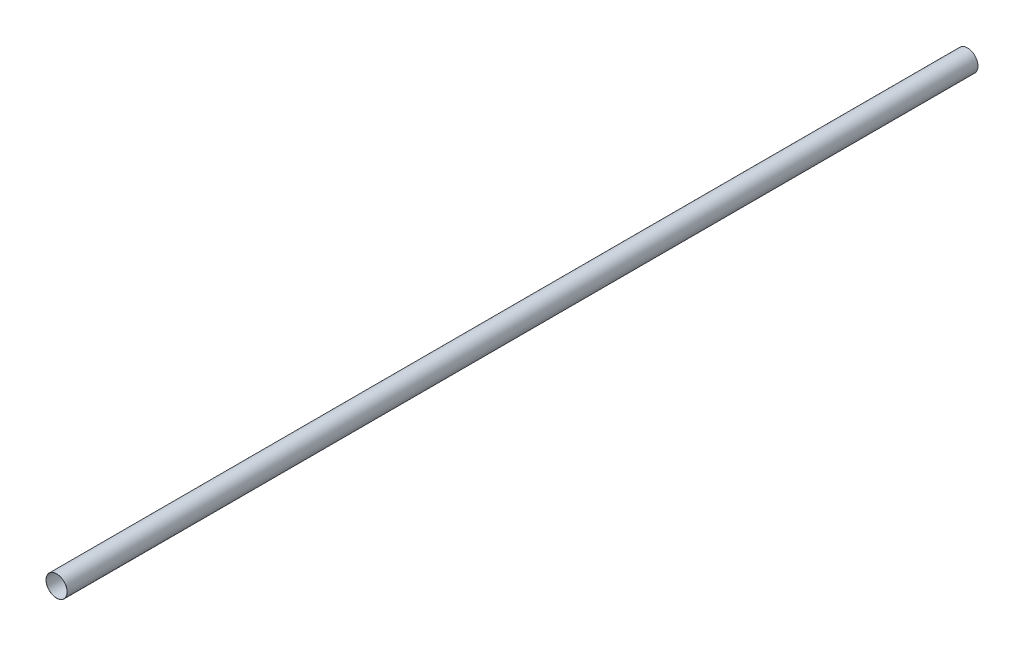
ISO-10303-21;
HEADER;
FILE_DESCRIPTION(('STEP AP214'),'2;1');
FILE_NAME('part.step','',(''),(''),'','','');
FILE_SCHEMA(('AUTOMOTIVE_DESIGN { 1 0 10303 214 1 1 1 1 }'));
ENDSEC;
DATA;
#1=APPLICATION_CONTEXT('core data for automotive mechanical design processes');
#2=APPLICATION_PROTOCOL_DEFINITION('international standard','automotive_design',2000,#1);
#3=PRODUCT_CONTEXT('',#1,'mechanical');
#4=PRODUCT('Part','Part','',(#3));
#5=PRODUCT_RELATED_PRODUCT_CATEGORY('part','',(#4));
#6=PRODUCT_DEFINITION_FORMATION('','',#4);
#7=PRODUCT_DEFINITION_CONTEXT('part definition',#1,'design');
#8=PRODUCT_DEFINITION('design','',#6,#7);
#9=PRODUCT_DEFINITION_SHAPE('','',#8);
#10=(LENGTH_UNIT() NAMED_UNIT(*) SI_UNIT(.MILLI.,.METRE.));
#11=(NAMED_UNIT(*) PLANE_ANGLE_UNIT() SI_UNIT($,.RADIAN.));
#12=(NAMED_UNIT(*) SI_UNIT($,.STERADIAN.) SOLID_ANGLE_UNIT());
#13=UNCERTAINTY_MEASURE_WITH_UNIT(LENGTH_MEASURE(1.E-05),#10,'distance_accuracy_value','');
#14=(GEOMETRIC_REPRESENTATION_CONTEXT(3) GLOBAL_UNCERTAINTY_ASSIGNED_CONTEXT((#13)) GLOBAL_UNIT_ASSIGNED_CONTEXT((#10,
#11,#12)) REPRESENTATION_CONTEXT('',''));
#15=CARTESIAN_POINT('',(0.,0.,0.));
#16=DIRECTION('',(0.,0.,1.));
#17=DIRECTION('',(1.,0.,0.));
#18=AXIS2_PLACEMENT_3D('',#15,#16,#17);
#19=CARTESIAN_POINT('',(0.,0.,820.));
#20=DIRECTION('',(0.,0.,1.));
#21=DIRECTION('',(1.,0.,0.));
#22=AXIS2_PLACEMENT_3D('',#19,#20,#21);
#23=PLANE('',#22);
#24=CARTESIAN_POINT('',(0.,0.,820.));
#25=DIRECTION('',(0.,0.,1.));
#26=DIRECTION('',(1.,0.,0.));
#27=AXIS2_PLACEMENT_3D('',#24,#25,#26);
#28=CIRCLE('',#27,9.525);
#29=CARTESIAN_POINT('',(-9.525,0.,820.));
#30=VERTEX_POINT('',#29);
#31=EDGE_CURVE('E10',#30,#30,#28,.T.);
#32=ORIENTED_EDGE('',*,*,#31,.T.);
#33=EDGE_LOOP('',(#32));
#34=FACE_BOUND('',#33,.T.);
#35=CARTESIAN_POINT('',(0.,0.,820.));
#36=DIRECTION('',(0.,0.,1.));
#37=DIRECTION('',(1.,0.,0.));
#38=AXIS2_PLACEMENT_3D('',#35,#36,#37);
#39=CIRCLE('',#38,9.4488);
#40=CARTESIAN_POINT('',(-9.4488,0.,820.));
#41=VERTEX_POINT('',#40);
#42=EDGE_CURVE('E52',#41,#41,#39,.T.);
#43=ORIENTED_EDGE('',*,*,#42,.F.);
#44=EDGE_LOOP('',(#43));
#45=FACE_BOUND('',#44,.T.);
#46=ADVANCED_FACE('F39',(#34,#45),#23,.T.);
#47=CARTESIAN_POINT('',(0.,0.,0.));
#48=DIRECTION('',(0.,0.,1.));
#49=DIRECTION('',(1.,0.,0.));
#50=AXIS2_PLACEMENT_3D('',#47,#48,#49);
#51=PLANE('',#50);
#52=CARTESIAN_POINT('',(0.,0.,0.));
#53=DIRECTION('',(0.,0.,1.));
#54=DIRECTION('',(1.,0.,0.));
#55=AXIS2_PLACEMENT_3D('',#52,#53,#54);
#56=CIRCLE('',#55,9.525);
#57=CARTESIAN_POINT('',(-9.525,0.,0.));
#58=VERTEX_POINT('',#57);
#59=EDGE_CURVE('E43',#58,#58,#56,.T.);
#60=ORIENTED_EDGE('',*,*,#59,.F.);
#61=EDGE_LOOP('',(#60));
#62=FACE_BOUND('',#61,.T.);
#63=CARTESIAN_POINT('',(0.,0.,0.));
#64=DIRECTION('',(0.,0.,1.));
#65=DIRECTION('',(1.,0.,0.));
#66=AXIS2_PLACEMENT_3D('',#63,#64,#65);
#67=CIRCLE('',#66,9.4488);
#68=CARTESIAN_POINT('',(-9.4488,0.,0.));
#69=VERTEX_POINT('',#68);
#70=EDGE_CURVE('E54',#69,#69,#67,.T.);
#71=ORIENTED_EDGE('',*,*,#70,.T.);
#72=EDGE_LOOP('',(#71));
#73=FACE_BOUND('',#72,.T.);
#74=ADVANCED_FACE('F66',(#62,#73),#51,.F.);
#75=CARTESIAN_POINT('',(0.,0.,820.));
#76=DIRECTION('',(0.,0.,-1.));
#77=DIRECTION('',(-1.,0.,0.));
#78=AXIS2_PLACEMENT_3D('',#75,#76,#77);
#79=CYLINDRICAL_SURFACE('',#78,9.525);
#80=CARTESIAN_POINT('',(-9.525,0.,820.));
#81=CARTESIAN_POINT('',(-9.525,0.,811.458333333333));
#82=CARTESIAN_POINT('',(-9.525,0.,802.916666666667));
#83=CARTESIAN_POINT('',(-9.525,0.,785.833333333333));
#84=CARTESIAN_POINT('',(-9.525,0.,777.291666666667));
#85=CARTESIAN_POINT('',(-9.525,0.,760.208333333333));
#86=CARTESIAN_POINT('',(-9.525,0.,751.666666666667));
#87=CARTESIAN_POINT('',(-9.525,0.,734.583333333333));
#88=CARTESIAN_POINT('',(-9.525,0.,726.041666666667));
#89=CARTESIAN_POINT('',(-9.525,0.,708.958333333333));
#90=CARTESIAN_POINT('',(-9.525,0.,700.416666666667));
#91=CARTESIAN_POINT('',(-9.525,0.,683.333333333333));
#92=CARTESIAN_POINT('',(-9.525,0.,674.791666666667));
#93=CARTESIAN_POINT('',(-9.525,0.,657.708333333333));
#94=CARTESIAN_POINT('',(-9.525,0.,649.166666666667));
#95=CARTESIAN_POINT('',(-9.525,0.,632.083333333333));
#96=CARTESIAN_POINT('',(-9.525,0.,623.541666666667));
#97=CARTESIAN_POINT('',(-9.525,0.,606.458333333333));
#98=CARTESIAN_POINT('',(-9.525,0.,597.916666666667));
#99=CARTESIAN_POINT('',(-9.525,0.,580.833333333333));
#100=CARTESIAN_POINT('',(-9.525,0.,572.291666666667));
#101=CARTESIAN_POINT('',(-9.525,0.,555.208333333333));
#102=CARTESIAN_POINT('',(-9.525,0.,546.666666666667));
#103=CARTESIAN_POINT('',(-9.525,0.,529.583333333333));
#104=CARTESIAN_POINT('',(-9.525,0.,521.041666666667));
#105=CARTESIAN_POINT('',(-9.525,0.,503.958333333333));
#106=CARTESIAN_POINT('',(-9.525,0.,495.416666666667));
#107=CARTESIAN_POINT('',(-9.525,0.,478.333333333333));
#108=CARTESIAN_POINT('',(-9.525,0.,469.791666666667));
#109=CARTESIAN_POINT('',(-9.525,0.,452.708333333333));
#110=CARTESIAN_POINT('',(-9.525,0.,444.166666666667));
#111=CARTESIAN_POINT('',(-9.525,0.,427.083333333333));
#112=CARTESIAN_POINT('',(-9.525,0.,418.541666666667));
#113=CARTESIAN_POINT('',(-9.525,0.,401.458333333333));
#114=CARTESIAN_POINT('',(-9.525,0.,392.916666666667));
#115=CARTESIAN_POINT('',(-9.525,0.,375.833333333333));
#116=CARTESIAN_POINT('',(-9.525,0.,367.291666666667));
#117=CARTESIAN_POINT('',(-9.525,0.,350.208333333333));
#118=CARTESIAN_POINT('',(-9.525,0.,341.666666666667));
#119=CARTESIAN_POINT('',(-9.525,0.,324.583333333333));
#120=CARTESIAN_POINT('',(-9.525,0.,316.041666666667));
#121=CARTESIAN_POINT('',(-9.525,0.,298.958333333333));
#122=CARTESIAN_POINT('',(-9.525,0.,290.416666666667));
#123=CARTESIAN_POINT('',(-9.525,0.,273.333333333333));
#124=CARTESIAN_POINT('',(-9.525,0.,264.791666666667));
#125=CARTESIAN_POINT('',(-9.525,0.,247.708333333333));
#126=CARTESIAN_POINT('',(-9.525,0.,239.166666666667));
#127=CARTESIAN_POINT('',(-9.525,0.,222.083333333333));
#128=CARTESIAN_POINT('',(-9.525,0.,213.541666666667));
#129=CARTESIAN_POINT('',(-9.525,0.,196.458333333333));
#130=CARTESIAN_POINT('',(-9.525,0.,187.916666666667));
#131=CARTESIAN_POINT('',(-9.525,0.,170.833333333333));
#132=CARTESIAN_POINT('',(-9.525,0.,162.291666666667));
#133=CARTESIAN_POINT('',(-9.525,0.,145.208333333333));
#134=CARTESIAN_POINT('',(-9.525,0.,136.666666666667));
#135=CARTESIAN_POINT('',(-9.525,0.,119.583333333333));
#136=CARTESIAN_POINT('',(-9.525,0.,111.041666666667));
#137=CARTESIAN_POINT('',(-9.525,0.,93.9583333333334));
#138=CARTESIAN_POINT('',(-9.525,0.,85.4166666666667));
#139=CARTESIAN_POINT('',(-9.525,0.,68.3333333333334));
#140=CARTESIAN_POINT('',(-9.525,0.,59.7916666666667));
#141=CARTESIAN_POINT('',(-9.525,0.,42.7083333333333));
#142=CARTESIAN_POINT('',(-9.525,0.,34.1666666666667));
#143=CARTESIAN_POINT('',(-9.525,0.,17.0833333333333));
#144=CARTESIAN_POINT('',(-9.525,0.,8.54166666666666));
#145=CARTESIAN_POINT('',(-9.525,0.,0.));
#146=B_SPLINE_CURVE_WITH_KNOTS('',3,(#80,#81,#82,#83,#84,#85,#86,#87,#88,#89,#90,#91,#92,#93,
#94,#95,#96,#97,#98,#99,#100,#101,#102,#103,#104,#105,#106,#107,#108,#109,#110,#111,#112,#113,
#114,#115,#116,#117,#118,#119,#120,#121,#122,#123,#124,#125,#126,#127,#128,#129,#130,#131,#132,
#133,#134,#135,#136,#137,#138,#139,#140,#141,#142,#143,#144,#145),.UNSPECIFIED.,.F.,.F.,(4,2,2,
2,2,2,2,2,2,2,2,2,2,2,2,2,2,2,2,2,2,2,2,2,2,2,2,2,2,2,2,2,4),(0.,25.6249999999999,
51.2499999999999,76.8749999999999,102.5,128.125,153.75,179.375,205.,230.625,256.25,281.875,
307.5,333.125,358.75,384.375,410.,435.625,461.25,486.875,512.5,538.125,563.75,589.375,615.,
640.625,666.25,691.875,717.5,743.125,768.75,794.375,820.),.UNSPECIFIED.);
#147=EDGE_CURVE('BSEAM41',#30,#58,#146,.T.);
#148=ORIENTED_EDGE('',*,*,#31,.F.);
#149=ORIENTED_EDGE('',*,*,#59,.T.);
#150=ORIENTED_EDGE('',*,*,#147,.T.);
#151=ORIENTED_EDGE('',*,*,#147,.F.);
#152=EDGE_LOOP('',(#148,#150,#149,#151));
#153=FACE_BOUND('',#152,.T.);
#154=ADVANCED_FACE('F41',(#153),#79,.T.);
#155=CARTESIAN_POINT('',(0.,0.,820.));
#156=DIRECTION('',(0.,0.,-1.));
#157=DIRECTION('',(-1.,0.,0.));
#158=AXIS2_PLACEMENT_3D('',#155,#156,#157);
#159=CYLINDRICAL_SURFACE('',#158,9.4488);
#160=CARTESIAN_POINT('',(-9.4488,0.,820.));
#161=CARTESIAN_POINT('',(-9.4488,0.,811.458333333333));
#162=CARTESIAN_POINT('',(-9.4488,0.,802.916666666667));
#163=CARTESIAN_POINT('',(-9.4488,0.,785.833333333333));
#164=CARTESIAN_POINT('',(-9.4488,0.,777.291666666667));
#165=CARTESIAN_POINT('',(-9.4488,0.,760.208333333333));
#166=CARTESIAN_POINT('',(-9.4488,0.,751.666666666667));
#167=CARTESIAN_POINT('',(-9.4488,0.,734.583333333333));
#168=CARTESIAN_POINT('',(-9.4488,0.,726.041666666667));
#169=CARTESIAN_POINT('',(-9.4488,0.,708.958333333333));
#170=CARTESIAN_POINT('',(-9.4488,0.,700.416666666667));
#171=CARTESIAN_POINT('',(-9.4488,0.,683.333333333333));
#172=CARTESIAN_POINT('',(-9.4488,0.,674.791666666667));
#173=CARTESIAN_POINT('',(-9.4488,0.,657.708333333333));
#174=CARTESIAN_POINT('',(-9.4488,0.,649.166666666667));
#175=CARTESIAN_POINT('',(-9.4488,0.,632.083333333333));
#176=CARTESIAN_POINT('',(-9.4488,0.,623.541666666667));
#177=CARTESIAN_POINT('',(-9.4488,0.,606.458333333333));
#178=CARTESIAN_POINT('',(-9.4488,0.,597.916666666667));
#179=CARTESIAN_POINT('',(-9.4488,0.,580.833333333333));
#180=CARTESIAN_POINT('',(-9.4488,0.,572.291666666667));
#181=CARTESIAN_POINT('',(-9.4488,0.,555.208333333333));
#182=CARTESIAN_POINT('',(-9.4488,0.,546.666666666667));
#183=CARTESIAN_POINT('',(-9.4488,0.,529.583333333333));
#184=CARTESIAN_POINT('',(-9.4488,0.,521.041666666667));
#185=CARTESIAN_POINT('',(-9.4488,0.,503.958333333333));
#186=CARTESIAN_POINT('',(-9.4488,0.,495.416666666667));
#187=CARTESIAN_POINT('',(-9.4488,0.,478.333333333333));
#188=CARTESIAN_POINT('',(-9.4488,0.,469.791666666667));
#189=CARTESIAN_POINT('',(-9.4488,0.,452.708333333333));
#190=CARTESIAN_POINT('',(-9.4488,0.,444.166666666667));
#191=CARTESIAN_POINT('',(-9.4488,0.,427.083333333333));
#192=CARTESIAN_POINT('',(-9.4488,0.,418.541666666667));
#193=CARTESIAN_POINT('',(-9.4488,0.,401.458333333333));
#194=CARTESIAN_POINT('',(-9.4488,0.,392.916666666667));
#195=CARTESIAN_POINT('',(-9.4488,0.,375.833333333333));
#196=CARTESIAN_POINT('',(-9.4488,0.,367.291666666667));
#197=CARTESIAN_POINT('',(-9.4488,0.,350.208333333333));
#198=CARTESIAN_POINT('',(-9.4488,0.,341.666666666667));
#199=CARTESIAN_POINT('',(-9.4488,0.,324.583333333333));
#200=CARTESIAN_POINT('',(-9.4488,0.,316.041666666667));
#201=CARTESIAN_POINT('',(-9.4488,0.,298.958333333333));
#202=CARTESIAN_POINT('',(-9.4488,0.,290.416666666667));
#203=CARTESIAN_POINT('',(-9.4488,0.,273.333333333333));
#204=CARTESIAN_POINT('',(-9.4488,0.,264.791666666667));
#205=CARTESIAN_POINT('',(-9.4488,0.,247.708333333333));
#206=CARTESIAN_POINT('',(-9.4488,0.,239.166666666667));
#207=CARTESIAN_POINT('',(-9.4488,0.,222.083333333333));
#208=CARTESIAN_POINT('',(-9.4488,0.,213.541666666667));
#209=CARTESIAN_POINT('',(-9.4488,0.,196.458333333333));
#210=CARTESIAN_POINT('',(-9.4488,0.,187.916666666667));
#211=CARTESIAN_POINT('',(-9.4488,0.,170.833333333333));
#212=CARTESIAN_POINT('',(-9.4488,0.,162.291666666667));
#213=CARTESIAN_POINT('',(-9.4488,0.,145.208333333333));
#214=CARTESIAN_POINT('',(-9.4488,0.,136.666666666667));
#215=CARTESIAN_POINT('',(-9.4488,0.,119.583333333333));
#216=CARTESIAN_POINT('',(-9.4488,0.,111.041666666667));
#217=CARTESIAN_POINT('',(-9.4488,0.,93.9583333333334));
#218=CARTESIAN_POINT('',(-9.4488,0.,85.4166666666667));
#219=CARTESIAN_POINT('',(-9.4488,0.,68.3333333333334));
#220=CARTESIAN_POINT('',(-9.4488,0.,59.7916666666667));
#221=CARTESIAN_POINT('',(-9.4488,0.,42.7083333333333));
#222=CARTESIAN_POINT('',(-9.4488,0.,34.1666666666667));
#223=CARTESIAN_POINT('',(-9.4488,0.,17.0833333333333));
#224=CARTESIAN_POINT('',(-9.4488,0.,8.54166666666666));
#225=CARTESIAN_POINT('',(-9.4488,0.,0.));
#226=B_SPLINE_CURVE_WITH_KNOTS('',3,(#160,#161,#162,#163,#164,#165,#166,#167,#168,#169,#170,
#171,#172,#173,#174,#175,#176,#177,#178,#179,#180,#181,#182,#183,#184,#185,#186,#187,#188,#189,
#190,#191,#192,#193,#194,#195,#196,#197,#198,#199,#200,#201,#202,#203,#204,#205,#206,#207,#208,
#209,#210,#211,#212,#213,#214,#215,#216,#217,#218,#219,#220,#221,#222,#223,#224,#225),
.UNSPECIFIED.,.F.,.F.,(4,2,2,2,2,2,2,2,2,2,2,2,2,2,2,2,2,2,2,2,2,2,2,2,2,2,2,2,2,2,2,2,4),(0.,
25.625,51.25,76.875,102.5,128.125,153.75,179.375,205.,230.625,256.25,281.875,307.5,333.125,
358.75,384.375,410.,435.625,461.25,486.875,512.5,538.125,563.75,589.375,615.,640.625,666.25,
691.875,717.5,743.125,768.75,794.375,820.),.UNSPECIFIED.);
#227=EDGE_CURVE('BSEAM62',#41,#69,#226,.T.);
#228=ORIENTED_EDGE('',*,*,#42,.T.);
#229=ORIENTED_EDGE('',*,*,#70,.F.);
#230=ORIENTED_EDGE('',*,*,#227,.T.);
#231=ORIENTED_EDGE('',*,*,#227,.F.);
#232=EDGE_LOOP('',(#228,#230,#229,#231));
#233=FACE_BOUND('',#232,.T.);
#234=ADVANCED_FACE('F62',(#233),#159,.F.);
#235=CLOSED_SHELL('',(#46,#74,#154,#234));
#236=MANIFOLD_SOLID_BREP('B2',#235);
#237=ADVANCED_BREP_SHAPE_REPRESENTATION('',(#18,#236),#14);
#238=SHAPE_DEFINITION_REPRESENTATION(#9,#237);
ENDSEC;
END-ISO-10303-21;
